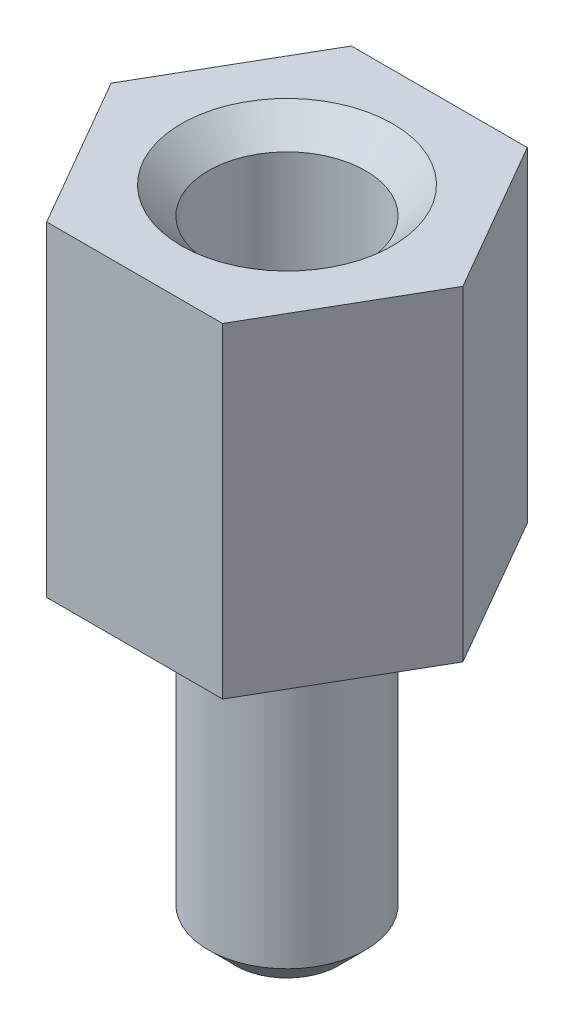
ISO-10303-21;
HEADER;
FILE_DESCRIPTION(('STEP AP214'),'2;1');
FILE_NAME('part.step','',(''),(''),'','','');
FILE_SCHEMA(('AUTOMOTIVE_DESIGN { 1 0 10303 214 1 1 1 1 }'));
ENDSEC;
DATA;
#1=APPLICATION_CONTEXT('core data for automotive mechanical design processes');
#2=APPLICATION_PROTOCOL_DEFINITION('international standard','automotive_design',2000,#1);
#3=PRODUCT_CONTEXT('',#1,'mechanical');
#4=PRODUCT('Part','Part','',(#3));
#5=PRODUCT_RELATED_PRODUCT_CATEGORY('part','',(#4));
#6=PRODUCT_DEFINITION_FORMATION('','',#4);
#7=PRODUCT_DEFINITION_CONTEXT('part definition',#1,'design');
#8=PRODUCT_DEFINITION('design','',#6,#7);
#9=PRODUCT_DEFINITION_SHAPE('','',#8);
#10=(LENGTH_UNIT() NAMED_UNIT(*) SI_UNIT(.MILLI.,.METRE.));
#11=(NAMED_UNIT(*) PLANE_ANGLE_UNIT() SI_UNIT($,.RADIAN.));
#12=(NAMED_UNIT(*) SI_UNIT($,.STERADIAN.) SOLID_ANGLE_UNIT());
#13=UNCERTAINTY_MEASURE_WITH_UNIT(LENGTH_MEASURE(1.E-05),#10,'distance_accuracy_value','');
#14=(GEOMETRIC_REPRESENTATION_CONTEXT(3) GLOBAL_UNCERTAINTY_ASSIGNED_CONTEXT((#13)) GLOBAL_UNIT_ASSIGNED_CONTEXT((#10,
#11,#12)) REPRESENTATION_CONTEXT('',''));
#15=CARTESIAN_POINT('',(0.,0.,0.));
#16=DIRECTION('',(0.,0.,1.));
#17=DIRECTION('',(1.,0.,0.));
#18=AXIS2_PLACEMENT_3D('',#15,#16,#17);
#19=CARTESIAN_POINT('',(1.62235425642285,6.,2.81));
#20=DIRECTION('',(-0.866025403784439,0.,-0.5));
#21=DIRECTION('',(-0.5,0.,0.866025403784439));
#22=AXIS2_PLACEMENT_3D('',#19,#20,#21);
#23=PLANE('',#22);
#24=DIRECTION('',(0.5,0.,-0.866025403784438));
#25=VECTOR('',#24,1.);
#26=CARTESIAN_POINT('',(1.62235425642285,0.,2.81));
#27=LINE('',#26,#25);
#28=CARTESIAN_POINT('',(1.62235425642285,0.,2.81));
#29=VERTEX_POINT('',#28);
#30=CARTESIAN_POINT('',(3.2447085128457,0.,0.));
#31=VERTEX_POINT('',#30);
#32=EDGE_CURVE('E118',#29,#31,#27,.T.);
#33=ORIENTED_EDGE('',*,*,#32,.T.);
#34=DIRECTION('',(0.,-1.,0.));
#35=VECTOR('',#34,1.);
#36=CARTESIAN_POINT('',(3.2447085128457,6.,0.));
#37=LINE('',#36,#35);
#38=CARTESIAN_POINT('',(3.2447085128457,6.,0.));
#39=VERTEX_POINT('',#38);
#40=EDGE_CURVE('E136',#39,#31,#37,.T.);
#41=ORIENTED_EDGE('',*,*,#40,.F.);
#42=DIRECTION('',(0.5,0.,-0.866025403784438));
#43=VECTOR('',#42,1.);
#44=CARTESIAN_POINT('',(1.62235425642285,6.,2.81));
#45=LINE('',#44,#43);
#46=CARTESIAN_POINT('',(1.62235425642285,6.,2.81));
#47=VERTEX_POINT('',#46);
#48=EDGE_CURVE('E129',#47,#39,#45,.T.);
#49=ORIENTED_EDGE('',*,*,#48,.F.);
#50=DIRECTION('',(0.,-1.,0.));
#51=VECTOR('',#50,1.);
#52=CARTESIAN_POINT('',(1.62235425642285,6.,2.81));
#53=LINE('',#52,#51);
#54=EDGE_CURVE('E114',#47,#29,#53,.T.);
#55=ORIENTED_EDGE('',*,*,#54,.T.);
#56=EDGE_LOOP('',(#33,#41,#49,#55));
#57=FACE_BOUND('',#56,.T.);
#58=ADVANCED_FACE('F32',(#57),#23,.F.);
#59=CARTESIAN_POINT('',(3.2447085128457,6.,0.));
#60=DIRECTION('',(-0.866025403784438,0.,0.5));
#61=DIRECTION('',(0.5,0.,0.866025403784439));
#62=AXIS2_PLACEMENT_3D('',#59,#60,#61);
#63=PLANE('',#62);
#64=DIRECTION('',(-0.5,0.,-0.866025403784438));
#65=VECTOR('',#64,1.);
#66=CARTESIAN_POINT('',(3.2447085128457,0.,0.));
#67=LINE('',#66,#65);
#68=CARTESIAN_POINT('',(1.62235425642285,0.,-2.81));
#69=VERTEX_POINT('',#68);
#70=EDGE_CURVE('E121',#31,#69,#67,.T.);
#71=ORIENTED_EDGE('',*,*,#70,.T.);
#72=DIRECTION('',(0.,-1.,0.));
#73=VECTOR('',#72,1.);
#74=CARTESIAN_POINT('',(1.62235425642285,6.,-2.81));
#75=LINE('',#74,#73);
#76=CARTESIAN_POINT('',(1.62235425642285,6.,-2.81));
#77=VERTEX_POINT('',#76);
#78=EDGE_CURVE('E133',#77,#69,#75,.T.);
#79=ORIENTED_EDGE('',*,*,#78,.F.);
#80=DIRECTION('',(-0.5,0.,-0.866025403784438));
#81=VECTOR('',#80,1.);
#82=CARTESIAN_POINT('',(3.2447085128457,6.,0.));
#83=LINE('',#82,#81);
#84=EDGE_CURVE('E87',#39,#77,#83,.T.);
#85=ORIENTED_EDGE('',*,*,#84,.F.);
#86=ORIENTED_EDGE('',*,*,#40,.T.);
#87=EDGE_LOOP('',(#71,#79,#85,#86));
#88=FACE_BOUND('',#87,.T.);
#89=ADVANCED_FACE('F159',(#88),#63,.F.);
#90=CARTESIAN_POINT('',(1.62235425642285,6.,-2.81));
#91=DIRECTION('',(0.,0.,1.));
#92=DIRECTION('',(1.,0.,0.));
#93=AXIS2_PLACEMENT_3D('',#90,#91,#92);
#94=PLANE('',#93);
#95=DIRECTION('',(-1.,0.,0.));
#96=VECTOR('',#95,1.);
#97=CARTESIAN_POINT('',(1.62235425642285,0.,-2.81));
#98=LINE('',#97,#96);
#99=CARTESIAN_POINT('',(-1.62235425642285,0.,-2.81));
#100=VERTEX_POINT('',#99);
#101=EDGE_CURVE('E124',#69,#100,#98,.T.);
#102=ORIENTED_EDGE('',*,*,#101,.T.);
#103=DIRECTION('',(0.,-1.,0.));
#104=VECTOR('',#103,1.);
#105=CARTESIAN_POINT('',(-1.62235425642285,6.,-2.81));
#106=LINE('',#105,#104);
#107=CARTESIAN_POINT('',(-1.62235425642285,6.,-2.81));
#108=VERTEX_POINT('',#107);
#109=EDGE_CURVE('E109',#108,#100,#106,.T.);
#110=ORIENTED_EDGE('',*,*,#109,.F.);
#111=DIRECTION('',(-1.,0.,0.));
#112=VECTOR('',#111,1.);
#113=CARTESIAN_POINT('',(1.62235425642285,6.,-2.81));
#114=LINE('',#113,#112);
#115=EDGE_CURVE('E100',#77,#108,#114,.T.);
#116=ORIENTED_EDGE('',*,*,#115,.F.);
#117=ORIENTED_EDGE('',*,*,#78,.T.);
#118=EDGE_LOOP('',(#102,#110,#116,#117));
#119=FACE_BOUND('',#118,.T.);
#120=ADVANCED_FACE('F165',(#119),#94,.F.);
#121=CARTESIAN_POINT('',(-1.62235425642285,6.,-2.81));
#122=DIRECTION('',(0.866025403784438,0.,0.5));
#123=DIRECTION('',(0.5,0.,-0.866025403784439));
#124=AXIS2_PLACEMENT_3D('',#121,#122,#123);
#125=PLANE('',#124);
#126=DIRECTION('',(-0.5,0.,0.866025403784439));
#127=VECTOR('',#126,1.);
#128=CARTESIAN_POINT('',(-1.62235425642285,0.,-2.81));
#129=LINE('',#128,#127);
#130=CARTESIAN_POINT('',(-3.2447085128457,0.,0.));
#131=VERTEX_POINT('',#130);
#132=EDGE_CURVE('E108',#100,#131,#129,.T.);
#133=ORIENTED_EDGE('',*,*,#132,.T.);
#134=DIRECTION('',(0.,-1.,0.));
#135=VECTOR('',#134,1.);
#136=CARTESIAN_POINT('',(-3.2447085128457,6.,0.));
#137=LINE('',#136,#135);
#138=CARTESIAN_POINT('',(-3.2447085128457,6.,0.));
#139=VERTEX_POINT('',#138);
#140=EDGE_CURVE('E105',#139,#131,#137,.T.);
#141=ORIENTED_EDGE('',*,*,#140,.F.);
#142=DIRECTION('',(-0.5,0.,0.866025403784439));
#143=VECTOR('',#142,1.);
#144=CARTESIAN_POINT('',(-1.62235425642285,6.,-2.81));
#145=LINE('',#144,#143);
#146=EDGE_CURVE('E94',#108,#139,#145,.T.);
#147=ORIENTED_EDGE('',*,*,#146,.F.);
#148=ORIENTED_EDGE('',*,*,#109,.T.);
#149=EDGE_LOOP('',(#133,#141,#147,#148));
#150=FACE_BOUND('',#149,.T.);
#151=ADVANCED_FACE('F106',(#150),#125,.F.);
#152=CARTESIAN_POINT('',(-3.2447085128457,6.,0.));
#153=DIRECTION('',(0.866025403784438,0.,-0.5));
#154=DIRECTION('',(-0.5,0.,-0.866025403784439));
#155=AXIS2_PLACEMENT_3D('',#152,#153,#154);
#156=PLANE('',#155);
#157=DIRECTION('',(0.5,0.,0.866025403784439));
#158=VECTOR('',#157,1.);
#159=CARTESIAN_POINT('',(-3.2447085128457,0.,0.));
#160=LINE('',#159,#158);
#161=CARTESIAN_POINT('',(-1.62235425642285,0.,2.81));
#162=VERTEX_POINT('',#161);
#163=EDGE_CURVE('E72',#131,#162,#160,.T.);
#164=ORIENTED_EDGE('',*,*,#163,.T.);
#165=DIRECTION('',(0.,-1.,0.));
#166=VECTOR('',#165,1.);
#167=CARTESIAN_POINT('',(-1.62235425642285,6.,2.81));
#168=LINE('',#167,#166);
#169=CARTESIAN_POINT('',(-1.62235425642285,6.,2.81));
#170=VERTEX_POINT('',#169);
#171=EDGE_CURVE('E110',#170,#162,#168,.T.);
#172=ORIENTED_EDGE('',*,*,#171,.F.);
#173=DIRECTION('',(0.5,0.,0.866025403784439));
#174=VECTOR('',#173,1.);
#175=CARTESIAN_POINT('',(-3.2447085128457,6.,0.));
#176=LINE('',#175,#174);
#177=EDGE_CURVE('E98',#139,#170,#176,.T.);
#178=ORIENTED_EDGE('',*,*,#177,.F.);
#179=ORIENTED_EDGE('',*,*,#140,.T.);
#180=EDGE_LOOP('',(#164,#172,#178,#179));
#181=FACE_BOUND('',#180,.T.);
#182=ADVANCED_FACE('F112',(#181),#156,.F.);
#183=CARTESIAN_POINT('',(-1.62235425642285,6.,2.81));
#184=DIRECTION('',(0.,0.,-1.));
#185=DIRECTION('',(-1.,0.,0.));
#186=AXIS2_PLACEMENT_3D('',#183,#184,#185);
#187=PLANE('',#186);
#188=DIRECTION('',(1.,0.,0.));
#189=VECTOR('',#188,1.);
#190=CARTESIAN_POINT('',(-1.62235425642285,0.,2.81));
#191=LINE('',#190,#189);
#192=EDGE_CURVE('E78',#162,#29,#191,.T.);
#193=ORIENTED_EDGE('',*,*,#192,.T.);
#194=ORIENTED_EDGE('',*,*,#54,.F.);
#195=DIRECTION('',(1.,0.,0.));
#196=VECTOR('',#195,1.);
#197=CARTESIAN_POINT('',(-1.62235425642285,6.,2.81));
#198=LINE('',#197,#196);
#199=EDGE_CURVE('E49',#170,#47,#198,.T.);
#200=ORIENTED_EDGE('',*,*,#199,.F.);
#201=ORIENTED_EDGE('',*,*,#171,.T.);
#202=EDGE_LOOP('',(#193,#194,#200,#201));
#203=FACE_BOUND('',#202,.T.);
#204=ADVANCED_FACE('F175',(#203),#187,.F.);
#205=CARTESIAN_POINT('',(0.,6.,0.));
#206=DIRECTION('',(0.,1.,0.));
#207=DIRECTION('',(0.,0.,1.));
#208=AXIS2_PLACEMENT_3D('',#205,#206,#207);
#209=PLANE('',#208);
#210=CARTESIAN_POINT('',(0.,6.,0.));
#211=DIRECTION('',(0.,1.,0.));
#212=DIRECTION('',(0.,0.,1.));
#213=AXIS2_PLACEMENT_3D('',#210,#211,#212);
#214=CIRCLE('',#213,1.95);
#215=CARTESIAN_POINT('',(0.,6.,1.95));
#216=VERTEX_POINT('',#215);
#217=EDGE_CURVE('E142',#216,#216,#214,.F.);
#218=ORIENTED_EDGE('',*,*,#217,.T.);
#219=EDGE_LOOP('',(#218));
#220=FACE_BOUND('',#219,.T.);
#221=ORIENTED_EDGE('',*,*,#48,.T.);
#222=ORIENTED_EDGE('',*,*,#84,.T.);
#223=ORIENTED_EDGE('',*,*,#115,.T.);
#224=ORIENTED_EDGE('',*,*,#146,.T.);
#225=ORIENTED_EDGE('',*,*,#177,.T.);
#226=ORIENTED_EDGE('',*,*,#199,.T.);
#227=EDGE_LOOP('',(#221,#222,#223,#224,#225,#226));
#228=FACE_BOUND('',#227,.T.);
#229=ADVANCED_FACE('F96',(#220,#228),#209,.T.);
#230=CARTESIAN_POINT('',(0.,0.,0.));
#231=DIRECTION('',(0.,1.,0.));
#232=DIRECTION('',(0.,0.,1.));
#233=AXIS2_PLACEMENT_3D('',#230,#231,#232);
#234=PLANE('',#233);
#235=CARTESIAN_POINT('',(0.,0.,0.));
#236=DIRECTION('',(0.,-1.,0.));
#237=DIRECTION('',(0.,0.,-1.));
#238=AXIS2_PLACEMENT_3D('',#235,#236,#237);
#239=CIRCLE('',#238,1.45);
#240=CARTESIAN_POINT('',(0.,0.,-1.45));
#241=VERTEX_POINT('',#240);
#242=EDGE_CURVE('E138',#241,#241,#239,.T.);
#243=ORIENTED_EDGE('',*,*,#242,.F.);
#244=EDGE_LOOP('',(#243));
#245=FACE_BOUND('',#244,.T.);
#246=ORIENTED_EDGE('',*,*,#32,.F.);
#247=ORIENTED_EDGE('',*,*,#192,.F.);
#248=ORIENTED_EDGE('',*,*,#163,.F.);
#249=ORIENTED_EDGE('',*,*,#132,.F.);
#250=ORIENTED_EDGE('',*,*,#101,.F.);
#251=ORIENTED_EDGE('',*,*,#70,.F.);
#252=EDGE_LOOP('',(#246,#247,#248,#249,#250,#251));
#253=FACE_BOUND('',#252,.T.);
#254=ADVANCED_FACE('F178',(#245,#253),#234,.F.);
#255=CARTESIAN_POINT('',(0.,-6.,0.));
#256=DIRECTION('',(0.,1.,0.));
#257=DIRECTION('',(0.,0.,1.));
#258=AXIS2_PLACEMENT_3D('',#255,#256,#257);
#259=CYLINDRICAL_SURFACE('',#258,1.45);
#260=CARTESIAN_POINT('',(0.,-5.5,0.));
#261=DIRECTION('',(0.,-1.,0.));
#262=DIRECTION('',(0.,0.,-1.));
#263=AXIS2_PLACEMENT_3D('',#260,#261,#262);
#264=CIRCLE('',#263,1.45);
#265=CARTESIAN_POINT('',(0.,-5.5,-1.45));
#266=VERTEX_POINT('',#265);
#267=EDGE_CURVE('E11',#266,#266,#264,.F.);
#268=ORIENTED_EDGE('',*,*,#267,.T.);
#269=EDGE_LOOP('',(#268));
#270=FACE_BOUND('',#269,.T.);
#271=ORIENTED_EDGE('',*,*,#242,.T.);
#272=EDGE_LOOP('',(#271));
#273=FACE_BOUND('',#272,.T.);
#274=ADVANCED_FACE('F181',(#270,#273),#259,.T.);
#275=CARTESIAN_POINT('',(0.,-6.,0.));
#276=DIRECTION('',(0.,-1.,0.));
#277=DIRECTION('',(0.,0.,-1.));
#278=AXIS2_PLACEMENT_3D('',#275,#276,#277);
#279=PLANE('',#278);
#280=CARTESIAN_POINT('',(0.,-6.,0.));
#281=DIRECTION('',(0.,-1.,0.));
#282=DIRECTION('',(0.,0.,-1.));
#283=AXIS2_PLACEMENT_3D('',#280,#281,#282);
#284=CIRCLE('',#283,0.950000000000001);
#285=CARTESIAN_POINT('',(0.,-6.,-0.950000000000001));
#286=VERTEX_POINT('',#285);
#287=EDGE_CURVE('E41',#286,#286,#284,.T.);
#288=ORIENTED_EDGE('',*,*,#287,.T.);
#289=EDGE_LOOP('',(#288));
#290=FACE_BOUND('',#289,.T.);
#291=ADVANCED_FACE('F147',(#290),#279,.T.);
#292=CARTESIAN_POINT('',(0.,1.,0.));
#293=DIRECTION('',(0.,1.,0.));
#294=DIRECTION('',(0.,0.,1.));
#295=AXIS2_PLACEMENT_3D('',#292,#293,#294);
#296=CYLINDRICAL_SURFACE('',#295,1.45);
#297=CARTESIAN_POINT('',(0.,5.5,0.));
#298=DIRECTION('',(0.,1.,0.));
#299=DIRECTION('',(0.,0.,1.));
#300=AXIS2_PLACEMENT_3D('',#297,#298,#299);
#301=CIRCLE('',#300,1.45);
#302=CARTESIAN_POINT('',(0.,5.5,1.45));
#303=VERTEX_POINT('',#302);
#304=EDGE_CURVE('E139',#303,#303,#301,.T.);
#305=ORIENTED_EDGE('',*,*,#304,.T.);
#306=EDGE_LOOP('',(#305));
#307=FACE_BOUND('',#306,.T.);
#308=CARTESIAN_POINT('',(0.,1.,0.));
#309=DIRECTION('',(0.,1.,0.));
#310=DIRECTION('',(0.,0.,1.));
#311=AXIS2_PLACEMENT_3D('',#308,#309,#310);
#312=CIRCLE('',#311,1.45);
#313=CARTESIAN_POINT('',(0.,1.,1.45));
#314=VERTEX_POINT('',#313);
#315=EDGE_CURVE('E122',#314,#314,#312,.T.);
#316=ORIENTED_EDGE('',*,*,#315,.F.);
#317=EDGE_LOOP('',(#316));
#318=FACE_BOUND('',#317,.T.);
#319=ADVANCED_FACE('F191',(#307,#318),#296,.F.);
#320=CARTESIAN_POINT('',(0.,1.,0.));
#321=DIRECTION('',(0.,1.,0.));
#322=DIRECTION('',(0.,0.,1.));
#323=AXIS2_PLACEMENT_3D('',#320,#321,#322);
#324=PLANE('',#323);
#325=ORIENTED_EDGE('',*,*,#315,.T.);
#326=EDGE_LOOP('',(#325));
#327=FACE_BOUND('',#326,.T.);
#328=ADVANCED_FACE('F155',(#327),#324,.T.);
#329=CARTESIAN_POINT('',(0.,5.5,0.));
#330=DIRECTION('',(0.,1.,0.));
#331=DIRECTION('',(0.,0.,1.));
#332=AXIS2_PLACEMENT_3D('',#329,#330,#331);
#333=CONICAL_SURFACE('',#332,1.45,0.785398163397448);
#334=ORIENTED_EDGE('',*,*,#217,.F.);
#335=EDGE_LOOP('',(#334));
#336=FACE_BOUND('',#335,.T.);
#337=ORIENTED_EDGE('',*,*,#304,.F.);
#338=EDGE_LOOP('',(#337));
#339=FACE_BOUND('',#338,.T.);
#340=ADVANCED_FACE('F150',(#336,#339),#333,.F.);
#341=CARTESIAN_POINT('',(0.,-6.,0.));
#342=DIRECTION('',(0.,1.,0.));
#343=DIRECTION('',(0.,0.,1.));
#344=AXIS2_PLACEMENT_3D('',#341,#342,#343);
#345=CONICAL_SURFACE('',#344,0.950000000000001,0.785398163397445);
#346=ORIENTED_EDGE('',*,*,#267,.F.);
#347=EDGE_LOOP('',(#346));
#348=FACE_BOUND('',#347,.T.);
#349=ORIENTED_EDGE('',*,*,#287,.F.);
#350=EDGE_LOOP('',(#349));
#351=FACE_BOUND('',#350,.T.);
#352=ADVANCED_FACE('F34',(#348,#351),#345,.T.);
#353=CLOSED_SHELL('',(#58,#89,#120,#151,#182,#204,#229,#254,#274,#291,#319,#328,#340,#352));
#354=MANIFOLD_SOLID_BREP('B2',#353);
#355=ADVANCED_BREP_SHAPE_REPRESENTATION('',(#18,#354),#14);
#356=SHAPE_DEFINITION_REPRESENTATION(#9,#355);
ENDSEC;
END-ISO-10303-21;
